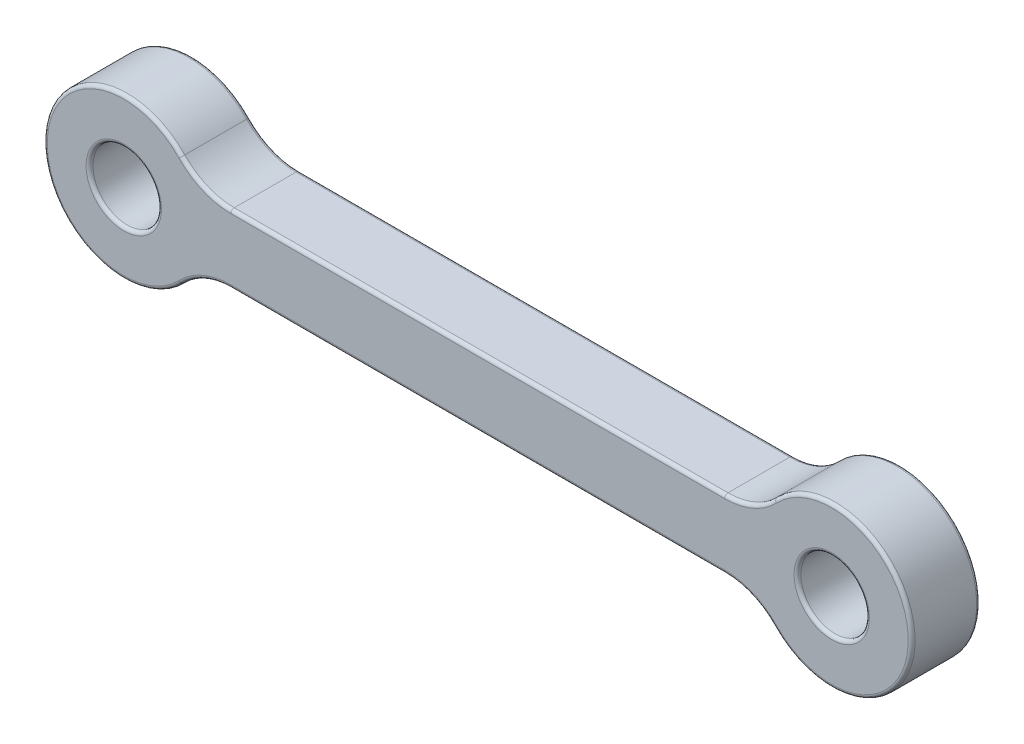
ISO-10303-21;
HEADER;
FILE_DESCRIPTION(('STEP AP214'),'2;1');
FILE_NAME('part.step','',(''),(''),'','','');
FILE_SCHEMA(('AUTOMOTIVE_DESIGN { 1 0 10303 214 1 1 1 1 }'));
ENDSEC;
DATA;
#1=APPLICATION_CONTEXT('core data for automotive mechanical design processes');
#2=APPLICATION_PROTOCOL_DEFINITION('international standard','automotive_design',2000,#1);
#3=PRODUCT_CONTEXT('',#1,'mechanical');
#4=PRODUCT('Part','Part','',(#3));
#5=PRODUCT_RELATED_PRODUCT_CATEGORY('part','',(#4));
#6=PRODUCT_DEFINITION_FORMATION('','',#4);
#7=PRODUCT_DEFINITION_CONTEXT('part definition',#1,'design');
#8=PRODUCT_DEFINITION('design','',#6,#7);
#9=PRODUCT_DEFINITION_SHAPE('','',#8);
#10=(LENGTH_UNIT() NAMED_UNIT(*) SI_UNIT(.MILLI.,.METRE.));
#11=(NAMED_UNIT(*) PLANE_ANGLE_UNIT() SI_UNIT($,.RADIAN.));
#12=(NAMED_UNIT(*) SI_UNIT($,.STERADIAN.) SOLID_ANGLE_UNIT());
#13=UNCERTAINTY_MEASURE_WITH_UNIT(LENGTH_MEASURE(1.E-05),#10,'distance_accuracy_value','');
#14=(GEOMETRIC_REPRESENTATION_CONTEXT(3) GLOBAL_UNCERTAINTY_ASSIGNED_CONTEXT((#13)) GLOBAL_UNIT_ASSIGNED_CONTEXT((#10,
#11,#12)) REPRESENTATION_CONTEXT('',''));
#15=CARTESIAN_POINT('',(0.,0.,0.));
#16=DIRECTION('',(0.,0.,1.));
#17=DIRECTION('',(1.,0.,0.));
#18=AXIS2_PLACEMENT_3D('',#15,#16,#17);
#19=CARTESIAN_POINT('',(0.,0.,1.5));
#20=DIRECTION('',(0.,0.,-1.));
#21=DIRECTION('',(-1.,0.,0.));
#22=AXIS2_PLACEMENT_3D('',#19,#20,#21);
#23=CYLINDRICAL_SURFACE('',#22,3.5);
#24=DIRECTION('',(0.,0.,-1.));
#25=VECTOR('',#24,1.);
#26=CARTESIAN_POINT('',(2.52560848605877,2.42307692307692,1.5));
#27=LINE('',#26,#25);
#28=CARTESIAN_POINT('',(2.52560848605877,2.42307692307692,1.35));
#29=VERTEX_POINT('',#28);
#30=CARTESIAN_POINT('',(2.52560848605877,2.42307692307692,-1.35));
#31=VERTEX_POINT('',#30);
#32=EDGE_CURVE('E302',#29,#31,#27,.T.);
#33=ORIENTED_EDGE('',*,*,#32,.T.);
#34=CARTESIAN_POINT('',(0.,0.,-1.35));
#35=DIRECTION('',(0.,0.,1.));
#36=DIRECTION('',(1.,0.,0.));
#37=AXIS2_PLACEMENT_3D('',#34,#35,#36);
#38=CIRCLE('',#37,3.5);
#39=CARTESIAN_POINT('',(2.52560848605877,-2.42307692307692,-1.35));
#40=VERTEX_POINT('',#39);
#41=EDGE_CURVE('E216',#31,#40,#38,.T.);
#42=ORIENTED_EDGE('',*,*,#41,.T.);
#43=DIRECTION('',(0.,0.,-1.));
#44=VECTOR('',#43,1.);
#45=CARTESIAN_POINT('',(2.52560848605877,-2.42307692307692,1.5));
#46=LINE('',#45,#44);
#47=CARTESIAN_POINT('',(2.52560848605877,-2.42307692307692,1.35));
#48=VERTEX_POINT('',#47);
#49=EDGE_CURVE('E295',#40,#48,#46,.F.);
#50=ORIENTED_EDGE('',*,*,#49,.T.);
#51=CARTESIAN_POINT('',(0.,0.,1.35));
#52=DIRECTION('',(0.,0.,1.));
#53=DIRECTION('',(1.,0.,0.));
#54=AXIS2_PLACEMENT_3D('',#51,#52,#53);
#55=CIRCLE('',#54,3.5);
#56=EDGE_CURVE('E214',#48,#29,#55,.F.);
#57=ORIENTED_EDGE('',*,*,#56,.T.);
#58=EDGE_LOOP('',(#33,#42,#50,#57));
#59=FACE_BOUND('',#58,.T.);
#60=ADVANCED_FACE('F36',(#59),#23,.T.);
#61=CARTESIAN_POINT('',(0.,-1.5,1.5));
#62=DIRECTION('',(0.,-1.,0.));
#63=DIRECTION('',(0.,0.,-1.));
#64=AXIS2_PLACEMENT_3D('',#61,#62,#63);
#65=PLANE('',#64);
#66=DIRECTION('',(0.,0.,-1.));
#67=VECTOR('',#66,1.);
#68=CARTESIAN_POINT('',(4.69041575982343,-1.5,1.5));
#69=LINE('',#68,#67);
#70=CARTESIAN_POINT('',(4.69041575982343,-1.5,1.35));
#71=VERTEX_POINT('',#70);
#72=CARTESIAN_POINT('',(4.69041575982343,-1.5,-1.35));
#73=VERTEX_POINT('',#72);
#74=EDGE_CURVE('E297',#71,#73,#69,.T.);
#75=ORIENTED_EDGE('',*,*,#74,.T.);
#76=DIRECTION('',(-1.,0.,0.));
#77=VECTOR('',#76,1.);
#78=CARTESIAN_POINT('',(26.3095842401766,-1.5,-1.35));
#79=LINE('',#78,#77);
#80=CARTESIAN_POINT('',(26.3095842401766,-1.5,-1.35));
#81=VERTEX_POINT('',#80);
#82=EDGE_CURVE('E191',#73,#81,#79,.F.);
#83=ORIENTED_EDGE('',*,*,#82,.T.);
#84=DIRECTION('',(0.,0.,1.));
#85=VECTOR('',#84,1.);
#86=CARTESIAN_POINT('',(26.3095842401766,-1.5,1.5));
#87=LINE('',#86,#85);
#88=CARTESIAN_POINT('',(26.3095842401766,-1.5,1.35));
#89=VERTEX_POINT('',#88);
#90=EDGE_CURVE('E257',#81,#89,#87,.T.);
#91=ORIENTED_EDGE('',*,*,#90,.T.);
#92=DIRECTION('',(-1.,0.,0.));
#93=VECTOR('',#92,1.);
#94=CARTESIAN_POINT('',(0.,-1.5,1.35));
#95=LINE('',#94,#93);
#96=EDGE_CURVE('E189',#89,#71,#95,.T.);
#97=ORIENTED_EDGE('',*,*,#96,.T.);
#98=EDGE_LOOP('',(#75,#83,#91,#97));
#99=FACE_BOUND('',#98,.T.);
#100=ADVANCED_FACE('F345',(#99),#65,.T.);
#101=CARTESIAN_POINT('',(31.,0.,1.5));
#102=DIRECTION('',(0.,0.,-1.));
#103=DIRECTION('',(-1.,0.,0.));
#104=AXIS2_PLACEMENT_3D('',#101,#102,#103);
#105=CYLINDRICAL_SURFACE('',#104,3.5);
#106=DIRECTION('',(0.,0.,-1.));
#107=VECTOR('',#106,1.);
#108=CARTESIAN_POINT('',(28.4743915139412,-2.42307692307692,1.5));
#109=LINE('',#108,#107);
#110=CARTESIAN_POINT('',(28.4743915139412,-2.42307692307692,1.35));
#111=VERTEX_POINT('',#110);
#112=CARTESIAN_POINT('',(28.4743915139412,-2.42307692307692,-1.35));
#113=VERTEX_POINT('',#112);
#114=EDGE_CURVE('E305',#111,#113,#109,.T.);
#115=ORIENTED_EDGE('',*,*,#114,.T.);
#116=CARTESIAN_POINT('',(31.,0.,-1.35));
#117=DIRECTION('',(0.,0.,1.));
#118=DIRECTION('',(1.,0.,0.));
#119=AXIS2_PLACEMENT_3D('',#116,#117,#118);
#120=CIRCLE('',#119,3.5);
#121=CARTESIAN_POINT('',(28.4743915139412,2.42307692307692,-1.35));
#122=VERTEX_POINT('',#121);
#123=EDGE_CURVE('E199',#113,#122,#120,.T.);
#124=ORIENTED_EDGE('',*,*,#123,.T.);
#125=DIRECTION('',(0.,0.,-1.));
#126=VECTOR('',#125,1.);
#127=CARTESIAN_POINT('',(28.4743915139412,2.42307692307692,1.5));
#128=LINE('',#127,#126);
#129=CARTESIAN_POINT('',(28.4743915139412,2.42307692307692,1.35));
#130=VERTEX_POINT('',#129);
#131=EDGE_CURVE('E301',#122,#130,#128,.F.);
#132=ORIENTED_EDGE('',*,*,#131,.T.);
#133=CARTESIAN_POINT('',(31.,0.,1.35));
#134=DIRECTION('',(0.,0.,1.));
#135=DIRECTION('',(1.,0.,0.));
#136=AXIS2_PLACEMENT_3D('',#133,#134,#135);
#137=CIRCLE('',#136,3.5);
#138=EDGE_CURVE('E197',#130,#111,#137,.F.);
#139=ORIENTED_EDGE('',*,*,#138,.T.);
#140=EDGE_LOOP('',(#115,#124,#132,#139));
#141=FACE_BOUND('',#140,.T.);
#142=ADVANCED_FACE('F391',(#141),#105,.T.);
#143=CARTESIAN_POINT('',(0.,1.5,1.5));
#144=DIRECTION('',(0.,-1.,0.));
#145=DIRECTION('',(0.,0.,-1.));
#146=AXIS2_PLACEMENT_3D('',#143,#144,#145);
#147=PLANE('',#146);
#148=DIRECTION('',(0.,0.,-1.));
#149=VECTOR('',#148,1.);
#150=CARTESIAN_POINT('',(26.3095842401766,1.5,1.5));
#151=LINE('',#150,#149);
#152=CARTESIAN_POINT('',(26.3095842401766,1.5,1.35));
#153=VERTEX_POINT('',#152);
#154=CARTESIAN_POINT('',(26.3095842401766,1.5,-1.35));
#155=VERTEX_POINT('',#154);
#156=EDGE_CURVE('E315',#153,#155,#151,.T.);
#157=ORIENTED_EDGE('',*,*,#156,.T.);
#158=DIRECTION('',(-1.,0.,0.));
#159=VECTOR('',#158,1.);
#160=CARTESIAN_POINT('',(0.,1.5,-1.35));
#161=LINE('',#160,#159);
#162=CARTESIAN_POINT('',(4.69041575982343,1.5,-1.35));
#163=VERTEX_POINT('',#162);
#164=EDGE_CURVE('E208',#155,#163,#161,.T.);
#165=ORIENTED_EDGE('',*,*,#164,.T.);
#166=DIRECTION('',(0.,0.,1.));
#167=VECTOR('',#166,1.);
#168=CARTESIAN_POINT('',(4.69041575982343,1.5,1.5));
#169=LINE('',#168,#167);
#170=CARTESIAN_POINT('',(4.69041575982343,1.5,1.35));
#171=VERTEX_POINT('',#170);
#172=EDGE_CURVE('E312',#163,#171,#169,.T.);
#173=ORIENTED_EDGE('',*,*,#172,.T.);
#174=DIRECTION('',(-1.,0.,0.));
#175=VECTOR('',#174,1.);
#176=CARTESIAN_POINT('',(26.3095842401766,1.5,1.35));
#177=LINE('',#176,#175);
#178=EDGE_CURVE('E206',#171,#153,#177,.F.);
#179=ORIENTED_EDGE('',*,*,#178,.T.);
#180=EDGE_LOOP('',(#157,#165,#173,#179));
#181=FACE_BOUND('',#180,.T.);
#182=ADVANCED_FACE('F375',(#181),#147,.F.);
#183=CARTESIAN_POINT('',(0.,0.,1.5));
#184=DIRECTION('',(0.,0.,-1.));
#185=DIRECTION('',(-1.,0.,0.));
#186=AXIS2_PLACEMENT_3D('',#183,#184,#185);
#187=CYLINDRICAL_SURFACE('',#186,1.5);
#188=CARTESIAN_POINT('',(0.,0.,-1.35));
#189=DIRECTION('',(0.,0.,1.));
#190=DIRECTION('',(1.,0.,0.));
#191=AXIS2_PLACEMENT_3D('',#188,#189,#190);
#192=CIRCLE('',#191,1.5);
#193=CARTESIAN_POINT('',(1.5,0.,-1.35));
#194=VERTEX_POINT('',#193);
#195=EDGE_CURVE('E221',#194,#194,#192,.F.);
#196=ORIENTED_EDGE('',*,*,#195,.T.);
#197=EDGE_LOOP('',(#196));
#198=FACE_BOUND('',#197,.T.);
#199=CARTESIAN_POINT('',(0.,0.,1.35));
#200=DIRECTION('',(0.,0.,1.));
#201=DIRECTION('',(1.,0.,0.));
#202=AXIS2_PLACEMENT_3D('',#199,#200,#201);
#203=CIRCLE('',#202,1.5);
#204=CARTESIAN_POINT('',(1.5,0.,1.35));
#205=VERTEX_POINT('',#204);
#206=EDGE_CURVE('E218',#205,#205,#203,.T.);
#207=ORIENTED_EDGE('',*,*,#206,.T.);
#208=EDGE_LOOP('',(#207));
#209=FACE_BOUND('',#208,.T.);
#210=ADVANCED_FACE('F398',(#198,#209),#187,.F.);
#211=CARTESIAN_POINT('',(31.,0.,1.5));
#212=DIRECTION('',(0.,0.,-1.));
#213=DIRECTION('',(-1.,0.,0.));
#214=AXIS2_PLACEMENT_3D('',#211,#212,#213);
#215=CYLINDRICAL_SURFACE('',#214,1.5);
#216=CARTESIAN_POINT('',(31.,0.,-1.35));
#217=DIRECTION('',(0.,0.,1.));
#218=DIRECTION('',(1.,0.,0.));
#219=AXIS2_PLACEMENT_3D('',#216,#217,#218);
#220=CIRCLE('',#219,1.5);
#221=CARTESIAN_POINT('',(32.5,0.,-1.35));
#222=VERTEX_POINT('',#221);
#223=EDGE_CURVE('E321',#222,#222,#220,.F.);
#224=ORIENTED_EDGE('',*,*,#223,.T.);
#225=EDGE_LOOP('',(#224));
#226=FACE_BOUND('',#225,.T.);
#227=CARTESIAN_POINT('',(31.,0.,1.35));
#228=DIRECTION('',(0.,0.,1.));
#229=DIRECTION('',(1.,0.,0.));
#230=AXIS2_PLACEMENT_3D('',#227,#228,#229);
#231=CIRCLE('',#230,1.5);
#232=CARTESIAN_POINT('',(32.5,0.,1.35));
#233=VERTEX_POINT('',#232);
#234=EDGE_CURVE('E318',#233,#233,#231,.T.);
#235=ORIENTED_EDGE('',*,*,#234,.T.);
#236=EDGE_LOOP('',(#235));
#237=FACE_BOUND('',#236,.T.);
#238=ADVANCED_FACE('F408',(#226,#237),#215,.F.);
#239=CARTESIAN_POINT('',(0.,0.,1.5));
#240=DIRECTION('',(0.,0.,1.));
#241=DIRECTION('',(1.,0.,0.));
#242=AXIS2_PLACEMENT_3D('',#239,#240,#241);
#243=PLANE('',#242);
#244=CARTESIAN_POINT('',(31.,0.,1.5));
#245=DIRECTION('',(0.,0.,1.));
#246=DIRECTION('',(1.,0.,0.));
#247=AXIS2_PLACEMENT_3D('',#244,#245,#246);
#248=CIRCLE('',#247,1.65);
#249=CARTESIAN_POINT('',(32.65,0.,1.5));
#250=VERTEX_POINT('',#249);
#251=EDGE_CURVE('E11',#250,#250,#248,.F.);
#252=ORIENTED_EDGE('',*,*,#251,.T.);
#253=EDGE_LOOP('',(#252));
#254=FACE_BOUND('',#253,.T.);
#255=CARTESIAN_POINT('',(31.,0.,1.5));
#256=DIRECTION('',(0.,0.,1.));
#257=DIRECTION('',(1.,0.,0.));
#258=AXIS2_PLACEMENT_3D('',#255,#256,#257);
#259=CIRCLE('',#258,3.35);
#260=CARTESIAN_POINT('',(28.5826318776295,-2.31923076923077,1.5));
#261=VERTEX_POINT('',#260);
#262=CARTESIAN_POINT('',(28.5826318776295,2.31923076923077,1.5));
#263=VERTEX_POINT('',#262);
#264=EDGE_CURVE('E53',#261,#263,#259,.T.);
#265=ORIENTED_EDGE('',*,*,#264,.T.);
#266=CARTESIAN_POINT('',(26.3095842401766,4.5,1.5));
#267=DIRECTION('',(0.,0.,1.));
#268=DIRECTION('',(1.,0.,0.));
#269=AXIS2_PLACEMENT_3D('',#266,#267,#268);
#270=CIRCLE('',#269,3.15);
#271=CARTESIAN_POINT('',(26.3095842401766,1.35,1.5));
#272=VERTEX_POINT('',#271);
#273=EDGE_CURVE('E45',#263,#272,#270,.F.);
#274=ORIENTED_EDGE('',*,*,#273,.T.);
#275=DIRECTION('',(-1.,0.,0.));
#276=VECTOR('',#275,1.);
#277=CARTESIAN_POINT('',(4.69041575982343,1.35,1.5));
#278=LINE('',#277,#276);
#279=CARTESIAN_POINT('',(4.69041575982343,1.35,1.5));
#280=VERTEX_POINT('',#279);
#281=EDGE_CURVE('E227',#272,#280,#278,.T.);
#282=ORIENTED_EDGE('',*,*,#281,.T.);
#283=CARTESIAN_POINT('',(4.69041575982343,4.5,1.5));
#284=DIRECTION('',(0.,0.,1.));
#285=DIRECTION('',(1.,0.,0.));
#286=AXIS2_PLACEMENT_3D('',#283,#284,#285);
#287=CIRCLE('',#286,3.15);
#288=CARTESIAN_POINT('',(2.41736812237053,2.31923076923077,1.5));
#289=VERTEX_POINT('',#288);
#290=EDGE_CURVE('E229',#280,#289,#287,.F.);
#291=ORIENTED_EDGE('',*,*,#290,.T.);
#292=CARTESIAN_POINT('',(0.,0.,1.5));
#293=DIRECTION('',(0.,0.,1.));
#294=DIRECTION('',(1.,0.,0.));
#295=AXIS2_PLACEMENT_3D('',#292,#293,#294);
#296=CIRCLE('',#295,3.35);
#297=CARTESIAN_POINT('',(2.41736812237053,-2.31923076923077,1.5));
#298=VERTEX_POINT('',#297);
#299=EDGE_CURVE('E231',#289,#298,#296,.T.);
#300=ORIENTED_EDGE('',*,*,#299,.T.);
#301=CARTESIAN_POINT('',(4.69041575982343,-4.5,1.5));
#302=DIRECTION('',(0.,0.,1.));
#303=DIRECTION('',(1.,0.,0.));
#304=AXIS2_PLACEMENT_3D('',#301,#302,#303);
#305=CIRCLE('',#304,3.15);
#306=CARTESIAN_POINT('',(4.69041575982343,-1.35,1.5));
#307=VERTEX_POINT('',#306);
#308=EDGE_CURVE('E233',#298,#307,#305,.F.);
#309=ORIENTED_EDGE('',*,*,#308,.T.);
#310=DIRECTION('',(-1.,0.,0.));
#311=VECTOR('',#310,1.);
#312=CARTESIAN_POINT('',(0.,-1.35,1.5));
#313=LINE('',#312,#311);
#314=CARTESIAN_POINT('',(26.3095842401766,-1.35,1.5));
#315=VERTEX_POINT('',#314);
#316=EDGE_CURVE('E235',#307,#315,#313,.F.);
#317=ORIENTED_EDGE('',*,*,#316,.T.);
#318=CARTESIAN_POINT('',(26.3095842401766,-4.5,1.5));
#319=DIRECTION('',(0.,0.,1.));
#320=DIRECTION('',(1.,0.,0.));
#321=AXIS2_PLACEMENT_3D('',#318,#319,#320);
#322=CIRCLE('',#321,3.15);
#323=EDGE_CURVE('E58',#315,#261,#322,.F.);
#324=ORIENTED_EDGE('',*,*,#323,.T.);
#325=EDGE_LOOP('',(#265,#274,#282,#291,#300,#309,#317,#324));
#326=FACE_BOUND('',#325,.T.);
#327=CARTESIAN_POINT('',(0.,0.,1.5));
#328=DIRECTION('',(0.,0.,1.));
#329=DIRECTION('',(1.,0.,0.));
#330=AXIS2_PLACEMENT_3D('',#327,#328,#329);
#331=CIRCLE('',#330,1.65);
#332=CARTESIAN_POINT('',(1.65,0.,1.5));
#333=VERTEX_POINT('',#332);
#334=EDGE_CURVE('E224',#333,#333,#331,.F.);
#335=ORIENTED_EDGE('',*,*,#334,.T.);
#336=EDGE_LOOP('',(#335));
#337=FACE_BOUND('',#336,.T.);
#338=ADVANCED_FACE('F362',(#254,#326,#337),#243,.T.);
#339=CARTESIAN_POINT('',(0.,0.,-1.5));
#340=DIRECTION('',(0.,0.,1.));
#341=DIRECTION('',(1.,0.,0.));
#342=AXIS2_PLACEMENT_3D('',#339,#340,#341);
#343=PLANE('',#342);
#344=CARTESIAN_POINT('',(31.,0.,-1.5));
#345=DIRECTION('',(0.,0.,1.));
#346=DIRECTION('',(1.,0.,0.));
#347=AXIS2_PLACEMENT_3D('',#344,#345,#346);
#348=CIRCLE('',#347,1.65);
#349=CARTESIAN_POINT('',(32.65,0.,-1.5));
#350=VERTEX_POINT('',#349);
#351=EDGE_CURVE('E178',#350,#350,#348,.T.);
#352=ORIENTED_EDGE('',*,*,#351,.T.);
#353=EDGE_LOOP('',(#352));
#354=FACE_BOUND('',#353,.T.);
#355=DIRECTION('',(-1.,0.,0.));
#356=VECTOR('',#355,1.);
#357=CARTESIAN_POINT('',(4.69041575982343,-1.35,-1.5));
#358=LINE('',#357,#356);
#359=CARTESIAN_POINT('',(26.3095842401766,-1.35,-1.5));
#360=VERTEX_POINT('',#359);
#361=CARTESIAN_POINT('',(4.69041575982343,-1.35,-1.5));
#362=VERTEX_POINT('',#361);
#363=EDGE_CURVE('E176',#360,#362,#358,.T.);
#364=ORIENTED_EDGE('',*,*,#363,.T.);
#365=CARTESIAN_POINT('',(4.69041575982343,-4.5,-1.5));
#366=DIRECTION('',(0.,0.,1.));
#367=DIRECTION('',(1.,0.,0.));
#368=AXIS2_PLACEMENT_3D('',#365,#366,#367);
#369=CIRCLE('',#368,3.15);
#370=CARTESIAN_POINT('',(2.41736812237053,-2.31923076923077,-1.5));
#371=VERTEX_POINT('',#370);
#372=EDGE_CURVE('E156',#362,#371,#369,.T.);
#373=ORIENTED_EDGE('',*,*,#372,.T.);
#374=CARTESIAN_POINT('',(0.,0.,-1.5));
#375=DIRECTION('',(0.,0.,1.));
#376=DIRECTION('',(1.,0.,0.));
#377=AXIS2_PLACEMENT_3D('',#374,#375,#376);
#378=CIRCLE('',#377,3.35);
#379=CARTESIAN_POINT('',(2.41736812237053,2.31923076923077,-1.5));
#380=VERTEX_POINT('',#379);
#381=EDGE_CURVE('E164',#371,#380,#378,.F.);
#382=ORIENTED_EDGE('',*,*,#381,.T.);
#383=CARTESIAN_POINT('',(4.69041575982343,4.5,-1.5));
#384=DIRECTION('',(0.,0.,1.));
#385=DIRECTION('',(1.,0.,0.));
#386=AXIS2_PLACEMENT_3D('',#383,#384,#385);
#387=CIRCLE('',#386,3.15);
#388=CARTESIAN_POINT('',(4.69041575982343,1.35,-1.5));
#389=VERTEX_POINT('',#388);
#390=EDGE_CURVE('E170',#380,#389,#387,.T.);
#391=ORIENTED_EDGE('',*,*,#390,.T.);
#392=DIRECTION('',(-1.,0.,0.));
#393=VECTOR('',#392,1.);
#394=CARTESIAN_POINT('',(0.,1.35,-1.5));
#395=LINE('',#394,#393);
#396=CARTESIAN_POINT('',(26.3095842401766,1.35,-1.5));
#397=VERTEX_POINT('',#396);
#398=EDGE_CURVE('E327',#389,#397,#395,.F.);
#399=ORIENTED_EDGE('',*,*,#398,.T.);
#400=CARTESIAN_POINT('',(26.3095842401766,4.5,-1.5));
#401=DIRECTION('',(0.,0.,1.));
#402=DIRECTION('',(1.,0.,0.));
#403=AXIS2_PLACEMENT_3D('',#400,#401,#402);
#404=CIRCLE('',#403,3.15);
#405=CARTESIAN_POINT('',(28.5826318776295,2.31923076923077,-1.5));
#406=VERTEX_POINT('',#405);
#407=EDGE_CURVE('E329',#397,#406,#404,.T.);
#408=ORIENTED_EDGE('',*,*,#407,.T.);
#409=CARTESIAN_POINT('',(31.,0.,-1.5));
#410=DIRECTION('',(0.,0.,1.));
#411=DIRECTION('',(1.,0.,0.));
#412=AXIS2_PLACEMENT_3D('',#409,#410,#411);
#413=CIRCLE('',#412,3.35);
#414=CARTESIAN_POINT('',(28.5826318776295,-2.31923076923077,-1.5));
#415=VERTEX_POINT('',#414);
#416=EDGE_CURVE('E331',#406,#415,#413,.F.);
#417=ORIENTED_EDGE('',*,*,#416,.T.);
#418=CARTESIAN_POINT('',(26.3095842401766,-4.5,-1.5));
#419=DIRECTION('',(0.,0.,1.));
#420=DIRECTION('',(1.,0.,0.));
#421=AXIS2_PLACEMENT_3D('',#418,#419,#420);
#422=CIRCLE('',#421,3.15);
#423=EDGE_CURVE('E183',#415,#360,#422,.T.);
#424=ORIENTED_EDGE('',*,*,#423,.T.);
#425=EDGE_LOOP('',(#364,#373,#382,#391,#399,#408,#417,#424));
#426=FACE_BOUND('',#425,.T.);
#427=CARTESIAN_POINT('',(0.,0.,-1.5));
#428=DIRECTION('',(0.,0.,1.));
#429=DIRECTION('',(1.,0.,0.));
#430=AXIS2_PLACEMENT_3D('',#427,#428,#429);
#431=CIRCLE('',#430,1.65);
#432=CARTESIAN_POINT('',(1.65,0.,-1.5));
#433=VERTEX_POINT('',#432);
#434=EDGE_CURVE('E171',#433,#433,#431,.T.);
#435=ORIENTED_EDGE('',*,*,#434,.T.);
#436=EDGE_LOOP('',(#435));
#437=FACE_BOUND('',#436,.T.);
#438=ADVANCED_FACE('F173',(#354,#426,#437),#343,.F.);
#439=CARTESIAN_POINT('',(4.69041575982343,-4.5,1.5));
#440=DIRECTION('',(0.,0.,-1.));
#441=DIRECTION('',(-1.,0.,0.));
#442=AXIS2_PLACEMENT_3D('',#439,#440,#441);
#443=CYLINDRICAL_SURFACE('',#442,3.);
#444=ORIENTED_EDGE('',*,*,#49,.F.);
#445=CARTESIAN_POINT('',(4.69041575982343,-4.5,-1.35));
#446=DIRECTION('',(0.,0.,1.));
#447=DIRECTION('',(1.,0.,0.));
#448=AXIS2_PLACEMENT_3D('',#445,#446,#447);
#449=CIRCLE('',#448,3.);
#450=EDGE_CURVE('E158',#40,#73,#449,.F.);
#451=ORIENTED_EDGE('',*,*,#450,.T.);
#452=ORIENTED_EDGE('',*,*,#74,.F.);
#453=CARTESIAN_POINT('',(4.69041575982343,-4.5,1.35));
#454=DIRECTION('',(0.,0.,1.));
#455=DIRECTION('',(1.,0.,0.));
#456=AXIS2_PLACEMENT_3D('',#453,#454,#455);
#457=CIRCLE('',#456,3.);
#458=EDGE_CURVE('E181',#71,#48,#457,.T.);
#459=ORIENTED_EDGE('',*,*,#458,.T.);
#460=EDGE_LOOP('',(#444,#451,#452,#459));
#461=FACE_BOUND('',#460,.T.);
#462=ADVANCED_FACE('F294',(#461),#443,.F.);
#463=CARTESIAN_POINT('',(26.3095842401766,-4.5,1.5));
#464=DIRECTION('',(0.,0.,-1.));
#465=DIRECTION('',(-1.,0.,0.));
#466=AXIS2_PLACEMENT_3D('',#463,#464,#465);
#467=CYLINDRICAL_SURFACE('',#466,3.);
#468=ORIENTED_EDGE('',*,*,#90,.F.);
#469=CARTESIAN_POINT('',(26.3095842401766,-4.5,-1.35));
#470=DIRECTION('',(0.,0.,1.));
#471=DIRECTION('',(1.,0.,0.));
#472=AXIS2_PLACEMENT_3D('',#469,#470,#471);
#473=CIRCLE('',#472,3.);
#474=EDGE_CURVE('E195',#81,#113,#473,.F.);
#475=ORIENTED_EDGE('',*,*,#474,.T.);
#476=ORIENTED_EDGE('',*,*,#114,.F.);
#477=CARTESIAN_POINT('',(26.3095842401766,-4.5,1.35));
#478=DIRECTION('',(0.,0.,1.));
#479=DIRECTION('',(1.,0.,0.));
#480=AXIS2_PLACEMENT_3D('',#477,#478,#479);
#481=CIRCLE('',#480,3.);
#482=EDGE_CURVE('E193',#111,#89,#481,.T.);
#483=ORIENTED_EDGE('',*,*,#482,.T.);
#484=EDGE_LOOP('',(#468,#475,#476,#483));
#485=FACE_BOUND('',#484,.T.);
#486=ADVANCED_FACE('F348',(#485),#467,.F.);
#487=CARTESIAN_POINT('',(26.3095842401766,4.5,1.5));
#488=DIRECTION('',(0.,0.,-1.));
#489=DIRECTION('',(-1.,0.,0.));
#490=AXIS2_PLACEMENT_3D('',#487,#488,#489);
#491=CYLINDRICAL_SURFACE('',#490,3.);
#492=ORIENTED_EDGE('',*,*,#131,.F.);
#493=CARTESIAN_POINT('',(26.3095842401766,4.5,-1.35));
#494=DIRECTION('',(0.,0.,1.));
#495=DIRECTION('',(1.,0.,0.));
#496=AXIS2_PLACEMENT_3D('',#493,#494,#495);
#497=CIRCLE('',#496,3.);
#498=EDGE_CURVE('E204',#122,#155,#497,.F.);
#499=ORIENTED_EDGE('',*,*,#498,.T.);
#500=ORIENTED_EDGE('',*,*,#156,.F.);
#501=CARTESIAN_POINT('',(26.3095842401766,4.5,1.35));
#502=DIRECTION('',(0.,0.,1.));
#503=DIRECTION('',(1.,0.,0.));
#504=AXIS2_PLACEMENT_3D('',#501,#502,#503);
#505=CIRCLE('',#504,3.);
#506=EDGE_CURVE('E201',#153,#130,#505,.T.);
#507=ORIENTED_EDGE('',*,*,#506,.T.);
#508=EDGE_LOOP('',(#492,#499,#500,#507));
#509=FACE_BOUND('',#508,.T.);
#510=ADVANCED_FACE('F380',(#509),#491,.F.);
#511=CARTESIAN_POINT('',(4.69041575982343,4.5,1.5));
#512=DIRECTION('',(0.,0.,-1.));
#513=DIRECTION('',(-1.,0.,0.));
#514=AXIS2_PLACEMENT_3D('',#511,#512,#513);
#515=CYLINDRICAL_SURFACE('',#514,3.);
#516=ORIENTED_EDGE('',*,*,#172,.F.);
#517=CARTESIAN_POINT('',(4.69041575982343,4.5,-1.35));
#518=DIRECTION('',(0.,0.,1.));
#519=DIRECTION('',(1.,0.,0.));
#520=AXIS2_PLACEMENT_3D('',#517,#518,#519);
#521=CIRCLE('',#520,3.);
#522=EDGE_CURVE('E212',#163,#31,#521,.F.);
#523=ORIENTED_EDGE('',*,*,#522,.T.);
#524=ORIENTED_EDGE('',*,*,#32,.F.);
#525=CARTESIAN_POINT('',(4.69041575982343,4.5,1.35));
#526=DIRECTION('',(0.,0.,1.));
#527=DIRECTION('',(1.,0.,0.));
#528=AXIS2_PLACEMENT_3D('',#525,#526,#527);
#529=CIRCLE('',#528,3.);
#530=EDGE_CURVE('E210',#29,#171,#529,.T.);
#531=ORIENTED_EDGE('',*,*,#530,.T.);
#532=EDGE_LOOP('',(#516,#523,#524,#531));
#533=FACE_BOUND('',#532,.T.);
#534=ADVANCED_FACE('F416',(#533),#515,.F.);
#535=CARTESIAN_POINT('',(31.,0.,-1.35));
#536=DIRECTION('',(0.,0.,1.));
#537=DIRECTION('',(1.,0.,0.));
#538=AXIS2_PLACEMENT_3D('',#535,#536,#537);
#539=TOROIDAL_SURFACE('',#538,1.65,0.15);
#540=ORIENTED_EDGE('',*,*,#351,.F.);
#541=EDGE_LOOP('',(#540));
#542=FACE_BOUND('',#541,.T.);
#543=ORIENTED_EDGE('',*,*,#223,.F.);
#544=EDGE_LOOP('',(#543));
#545=FACE_BOUND('',#544,.T.);
#546=ADVANCED_FACE('F419',(#542,#545),#539,.T.);
#547=CARTESIAN_POINT('',(26.3095842401766,4.5,-1.35));
#548=DIRECTION('',(0.,0.,1.));
#549=DIRECTION('',(1.,0.,0.));
#550=AXIS2_PLACEMENT_3D('',#547,#548,#549);
#551=TOROIDAL_SURFACE('',#550,3.15,0.15);
#552=CARTESIAN_POINT('',(26.3095842401766,1.35,-1.35));
#553=DIRECTION('',(-1.,0.,0.));
#554=DIRECTION('',(0.,0.,1.));
#555=AXIS2_PLACEMENT_3D('',#552,#553,#554);
#556=CIRCLE('',#555,0.15);
#557=EDGE_CURVE('E251',#155,#397,#556,.T.);
#558=ORIENTED_EDGE('',*,*,#557,.F.);
#559=ORIENTED_EDGE('',*,*,#498,.F.);
#560=CARTESIAN_POINT('',(28.5826318776295,2.31923076923077,-1.35));
#561=DIRECTION('',(0.692307692307703,0.72160242458821,0.));
#562=DIRECTION('',(-0.72160242458821,0.692307692307703,0.));
#563=AXIS2_PLACEMENT_3D('',#560,#561,#562);
#564=CIRCLE('',#563,0.15);
#565=EDGE_CURVE('E254',#406,#122,#564,.T.);
#566=ORIENTED_EDGE('',*,*,#565,.F.);
#567=ORIENTED_EDGE('',*,*,#407,.F.);
#568=EDGE_LOOP('',(#558,#559,#566,#567));
#569=FACE_BOUND('',#568,.T.);
#570=ADVANCED_FACE('F384',(#569),#551,.T.);
#571=CARTESIAN_POINT('',(31.,0.,-1.35));
#572=DIRECTION('',(0.,0.,1.));
#573=DIRECTION('',(1.,0.,0.));
#574=AXIS2_PLACEMENT_3D('',#571,#572,#573);
#575=TOROIDAL_SURFACE('',#574,3.35,0.15);
#576=ORIENTED_EDGE('',*,*,#565,.T.);
#577=ORIENTED_EDGE('',*,*,#123,.F.);
#578=CARTESIAN_POINT('',(28.5826318776295,-2.31923076923077,-1.35));
#579=DIRECTION('',(-0.692307692307698,0.721602424588214,0.));
#580=DIRECTION('',(-0.721602424588214,-0.692307692307698,0.));
#581=AXIS2_PLACEMENT_3D('',#578,#579,#580);
#582=CIRCLE('',#581,0.15);
#583=EDGE_CURVE('E248',#415,#113,#582,.T.);
#584=ORIENTED_EDGE('',*,*,#583,.F.);
#585=ORIENTED_EDGE('',*,*,#416,.F.);
#586=EDGE_LOOP('',(#576,#577,#584,#585));
#587=FACE_BOUND('',#586,.T.);
#588=ADVANCED_FACE('F389',(#587),#575,.T.);
#589=CARTESIAN_POINT('',(0.,1.35,-1.35));
#590=DIRECTION('',(-1.,0.,0.));
#591=DIRECTION('',(0.,0.,1.));
#592=AXIS2_PLACEMENT_3D('',#589,#590,#591);
#593=CYLINDRICAL_SURFACE('',#592,0.15);
#594=ORIENTED_EDGE('',*,*,#557,.T.);
#595=ORIENTED_EDGE('',*,*,#398,.F.);
#596=CARTESIAN_POINT('',(4.69041575982343,1.35,-1.35));
#597=DIRECTION('',(-1.,0.,0.));
#598=DIRECTION('',(0.,0.,1.));
#599=AXIS2_PLACEMENT_3D('',#596,#597,#598);
#600=CIRCLE('',#599,0.15);
#601=EDGE_CURVE('E245',#163,#389,#600,.T.);
#602=ORIENTED_EDGE('',*,*,#601,.F.);
#603=ORIENTED_EDGE('',*,*,#164,.F.);
#604=EDGE_LOOP('',(#594,#595,#602,#603));
#605=FACE_BOUND('',#604,.T.);
#606=ADVANCED_FACE('F437',(#605),#593,.T.);
#607=CARTESIAN_POINT('',(26.3095842401766,-4.5,-1.35));
#608=DIRECTION('',(0.,0.,1.));
#609=DIRECTION('',(1.,0.,0.));
#610=AXIS2_PLACEMENT_3D('',#607,#608,#609);
#611=TOROIDAL_SURFACE('',#610,3.15,0.15);
#612=ORIENTED_EDGE('',*,*,#583,.T.);
#613=ORIENTED_EDGE('',*,*,#474,.F.);
#614=CARTESIAN_POINT('',(26.3095842401766,-1.35,-1.35));
#615=DIRECTION('',(-1.,0.,0.));
#616=DIRECTION('',(0.,0.,1.));
#617=AXIS2_PLACEMENT_3D('',#614,#615,#616);
#618=CIRCLE('',#617,0.15);
#619=EDGE_CURVE('E242',#360,#81,#618,.T.);
#620=ORIENTED_EDGE('',*,*,#619,.F.);
#621=ORIENTED_EDGE('',*,*,#423,.F.);
#622=EDGE_LOOP('',(#612,#613,#620,#621));
#623=FACE_BOUND('',#622,.T.);
#624=ADVANCED_FACE('F338',(#623),#611,.T.);
#625=CARTESIAN_POINT('',(4.69041575982343,4.5,-1.35));
#626=DIRECTION('',(0.,0.,1.));
#627=DIRECTION('',(1.,0.,0.));
#628=AXIS2_PLACEMENT_3D('',#625,#626,#627);
#629=TOROIDAL_SURFACE('',#628,3.15,0.15);
#630=ORIENTED_EDGE('',*,*,#601,.T.);
#631=ORIENTED_EDGE('',*,*,#390,.F.);
#632=CARTESIAN_POINT('',(2.41736812237053,2.31923076923077,-1.35));
#633=DIRECTION('',(-0.692307692307693,0.72160242458822,0.));
#634=DIRECTION('',(-0.72160242458822,-0.692307692307693,0.));
#635=AXIS2_PLACEMENT_3D('',#632,#633,#634);
#636=CIRCLE('',#635,0.15);
#637=EDGE_CURVE('E167',#31,#380,#636,.T.);
#638=ORIENTED_EDGE('',*,*,#637,.F.);
#639=ORIENTED_EDGE('',*,*,#522,.F.);
#640=EDGE_LOOP('',(#630,#631,#638,#639));
#641=FACE_BOUND('',#640,.T.);
#642=ADVANCED_FACE('F431',(#641),#629,.T.);
#643=CARTESIAN_POINT('',(0.,-1.35,-1.35));
#644=DIRECTION('',(1.,0.,0.));
#645=DIRECTION('',(0.,0.,-1.));
#646=AXIS2_PLACEMENT_3D('',#643,#644,#645);
#647=CYLINDRICAL_SURFACE('',#646,0.15);
#648=ORIENTED_EDGE('',*,*,#619,.T.);
#649=ORIENTED_EDGE('',*,*,#82,.F.);
#650=CARTESIAN_POINT('',(4.69041575982343,-1.35,-1.35));
#651=DIRECTION('',(-1.,0.,0.));
#652=DIRECTION('',(0.,0.,1.));
#653=AXIS2_PLACEMENT_3D('',#650,#651,#652);
#654=CIRCLE('',#653,0.15);
#655=EDGE_CURVE('E161',#362,#73,#654,.T.);
#656=ORIENTED_EDGE('',*,*,#655,.F.);
#657=ORIENTED_EDGE('',*,*,#363,.F.);
#658=EDGE_LOOP('',(#648,#649,#656,#657));
#659=FACE_BOUND('',#658,.T.);
#660=ADVANCED_FACE('F341',(#659),#647,.T.);
#661=CARTESIAN_POINT('',(0.,0.,-1.35));
#662=DIRECTION('',(0.,0.,1.));
#663=DIRECTION('',(1.,0.,0.));
#664=AXIS2_PLACEMENT_3D('',#661,#662,#663);
#665=TOROIDAL_SURFACE('',#664,3.35,0.15);
#666=ORIENTED_EDGE('',*,*,#637,.T.);
#667=ORIENTED_EDGE('',*,*,#381,.F.);
#668=CARTESIAN_POINT('',(2.41736812237053,-2.31923076923077,-1.35));
#669=DIRECTION('',(0.692307692307693,0.72160242458822,0.));
#670=DIRECTION('',(-0.72160242458822,0.692307692307693,0.));
#671=AXIS2_PLACEMENT_3D('',#668,#669,#670);
#672=CIRCLE('',#671,0.15);
#673=EDGE_CURVE('E152',#40,#371,#672,.T.);
#674=ORIENTED_EDGE('',*,*,#673,.F.);
#675=ORIENTED_EDGE('',*,*,#41,.F.);
#676=EDGE_LOOP('',(#666,#667,#674,#675));
#677=FACE_BOUND('',#676,.T.);
#678=ADVANCED_FACE('F165',(#677),#665,.T.);
#679=CARTESIAN_POINT('',(4.69041575982343,-4.5,-1.35));
#680=DIRECTION('',(0.,0.,1.));
#681=DIRECTION('',(1.,0.,0.));
#682=AXIS2_PLACEMENT_3D('',#679,#680,#681);
#683=TOROIDAL_SURFACE('',#682,3.15,0.15);
#684=ORIENTED_EDGE('',*,*,#655,.T.);
#685=ORIENTED_EDGE('',*,*,#450,.F.);
#686=ORIENTED_EDGE('',*,*,#673,.T.);
#687=ORIENTED_EDGE('',*,*,#372,.F.);
#688=EDGE_LOOP('',(#684,#685,#686,#687));
#689=FACE_BOUND('',#688,.T.);
#690=ADVANCED_FACE('F154',(#689),#683,.T.);
#691=CARTESIAN_POINT('',(0.,0.,-1.35));
#692=DIRECTION('',(0.,0.,1.));
#693=DIRECTION('',(1.,0.,0.));
#694=AXIS2_PLACEMENT_3D('',#691,#692,#693);
#695=TOROIDAL_SURFACE('',#694,1.65,0.15);
#696=ORIENTED_EDGE('',*,*,#195,.F.);
#697=EDGE_LOOP('',(#696));
#698=FACE_BOUND('',#697,.T.);
#699=ORIENTED_EDGE('',*,*,#434,.F.);
#700=EDGE_LOOP('',(#699));
#701=FACE_BOUND('',#700,.T.);
#702=ADVANCED_FACE('F426',(#698,#701),#695,.T.);
#703=CARTESIAN_POINT('',(31.,0.,1.35));
#704=DIRECTION('',(0.,0.,1.));
#705=DIRECTION('',(1.,0.,0.));
#706=AXIS2_PLACEMENT_3D('',#703,#704,#705);
#707=TOROIDAL_SURFACE('',#706,1.65,0.15);
#708=ORIENTED_EDGE('',*,*,#234,.F.);
#709=EDGE_LOOP('',(#708));
#710=FACE_BOUND('',#709,.T.);
#711=ORIENTED_EDGE('',*,*,#251,.F.);
#712=EDGE_LOOP('',(#711));
#713=FACE_BOUND('',#712,.T.);
#714=ADVANCED_FACE('F447',(#710,#713),#707,.T.);
#715=CARTESIAN_POINT('',(4.69041575982343,-4.5,1.35));
#716=DIRECTION('',(0.,0.,1.));
#717=DIRECTION('',(1.,0.,0.));
#718=AXIS2_PLACEMENT_3D('',#715,#716,#717);
#719=TOROIDAL_SURFACE('',#718,3.15,0.15);
#720=CARTESIAN_POINT('',(2.41736812237053,-2.31923076923077,1.35));
#721=DIRECTION('',(-0.692307692307693,-0.72160242458822,0.));
#722=DIRECTION('',(0.72160242458822,-0.692307692307693,0.));
#723=AXIS2_PLACEMENT_3D('',#720,#721,#722);
#724=CIRCLE('',#723,0.15);
#725=EDGE_CURVE('E273',#48,#298,#724,.T.);
#726=ORIENTED_EDGE('',*,*,#725,.F.);
#727=ORIENTED_EDGE('',*,*,#458,.F.);
#728=CARTESIAN_POINT('',(4.69041575982343,-1.35,1.35));
#729=DIRECTION('',(1.,0.,0.));
#730=DIRECTION('',(0.,0.,-1.));
#731=AXIS2_PLACEMENT_3D('',#728,#729,#730);
#732=CIRCLE('',#731,0.15);
#733=EDGE_CURVE('E40',#307,#71,#732,.T.);
#734=ORIENTED_EDGE('',*,*,#733,.F.);
#735=ORIENTED_EDGE('',*,*,#308,.F.);
#736=EDGE_LOOP('',(#726,#727,#734,#735));
#737=FACE_BOUND('',#736,.T.);
#738=ADVANCED_FACE('F289',(#737),#719,.T.);
#739=CARTESIAN_POINT('',(0.,-1.35,1.35));
#740=DIRECTION('',(-1.,0.,0.));
#741=DIRECTION('',(0.,0.,1.));
#742=AXIS2_PLACEMENT_3D('',#739,#740,#741);
#743=CYLINDRICAL_SURFACE('',#742,0.15);
#744=ORIENTED_EDGE('',*,*,#733,.T.);
#745=ORIENTED_EDGE('',*,*,#96,.F.);
#746=CARTESIAN_POINT('',(26.3095842401766,-1.35,1.35));
#747=DIRECTION('',(1.,0.,0.));
#748=DIRECTION('',(0.,0.,-1.));
#749=AXIS2_PLACEMENT_3D('',#746,#747,#748);
#750=CIRCLE('',#749,0.15);
#751=EDGE_CURVE('E271',#315,#89,#750,.T.);
#752=ORIENTED_EDGE('',*,*,#751,.F.);
#753=ORIENTED_EDGE('',*,*,#316,.F.);
#754=EDGE_LOOP('',(#744,#745,#752,#753));
#755=FACE_BOUND('',#754,.T.);
#756=ADVANCED_FACE('F284',(#755),#743,.T.);
#757=CARTESIAN_POINT('',(0.,0.,1.35));
#758=DIRECTION('',(0.,0.,1.));
#759=DIRECTION('',(1.,0.,0.));
#760=AXIS2_PLACEMENT_3D('',#757,#758,#759);
#761=TOROIDAL_SURFACE('',#760,3.35,0.15);
#762=ORIENTED_EDGE('',*,*,#725,.T.);
#763=ORIENTED_EDGE('',*,*,#299,.F.);
#764=CARTESIAN_POINT('',(2.41736812237053,2.31923076923077,1.35));
#765=DIRECTION('',(0.692307692307693,-0.72160242458822,0.));
#766=DIRECTION('',(0.72160242458822,0.692307692307693,0.));
#767=AXIS2_PLACEMENT_3D('',#764,#765,#766);
#768=CIRCLE('',#767,0.15);
#769=EDGE_CURVE('E268',#29,#289,#768,.T.);
#770=ORIENTED_EDGE('',*,*,#769,.F.);
#771=ORIENTED_EDGE('',*,*,#56,.F.);
#772=EDGE_LOOP('',(#762,#763,#770,#771));
#773=FACE_BOUND('',#772,.T.);
#774=ADVANCED_FACE('F462',(#773),#761,.T.);
#775=CARTESIAN_POINT('',(26.3095842401766,-4.5,1.35));
#776=DIRECTION('',(0.,0.,1.));
#777=DIRECTION('',(1.,0.,0.));
#778=AXIS2_PLACEMENT_3D('',#775,#776,#777);
#779=TOROIDAL_SURFACE('',#778,3.15,0.15);
#780=ORIENTED_EDGE('',*,*,#751,.T.);
#781=ORIENTED_EDGE('',*,*,#482,.F.);
#782=CARTESIAN_POINT('',(28.5826318776295,-2.31923076923077,1.35));
#783=DIRECTION('',(0.692307692307703,-0.72160242458821,0.));
#784=DIRECTION('',(0.72160242458821,0.692307692307703,0.));
#785=AXIS2_PLACEMENT_3D('',#782,#783,#784);
#786=CIRCLE('',#785,0.15);
#787=EDGE_CURVE('E265',#261,#111,#786,.T.);
#788=ORIENTED_EDGE('',*,*,#787,.F.);
#789=ORIENTED_EDGE('',*,*,#323,.F.);
#790=EDGE_LOOP('',(#780,#781,#788,#789));
#791=FACE_BOUND('',#790,.T.);
#792=ADVANCED_FACE('F352',(#791),#779,.T.);
#793=CARTESIAN_POINT('',(4.69041575982343,4.5,1.35));
#794=DIRECTION('',(0.,0.,1.));
#795=DIRECTION('',(1.,0.,0.));
#796=AXIS2_PLACEMENT_3D('',#793,#794,#795);
#797=TOROIDAL_SURFACE('',#796,3.15,0.15);
#798=ORIENTED_EDGE('',*,*,#769,.T.);
#799=ORIENTED_EDGE('',*,*,#290,.F.);
#800=CARTESIAN_POINT('',(4.69041575982343,1.35,1.35));
#801=DIRECTION('',(1.,0.,0.));
#802=DIRECTION('',(0.,0.,-1.));
#803=AXIS2_PLACEMENT_3D('',#800,#801,#802);
#804=CIRCLE('',#803,0.15);
#805=EDGE_CURVE('E262',#171,#280,#804,.T.);
#806=ORIENTED_EDGE('',*,*,#805,.F.);
#807=ORIENTED_EDGE('',*,*,#530,.F.);
#808=EDGE_LOOP('',(#798,#799,#806,#807));
#809=FACE_BOUND('',#808,.T.);
#810=ADVANCED_FACE('F368',(#809),#797,.T.);
#811=CARTESIAN_POINT('',(31.,0.,1.35));
#812=DIRECTION('',(0.,0.,1.));
#813=DIRECTION('',(1.,0.,0.));
#814=AXIS2_PLACEMENT_3D('',#811,#812,#813);
#815=TOROIDAL_SURFACE('',#814,3.35,0.15);
#816=ORIENTED_EDGE('',*,*,#787,.T.);
#817=ORIENTED_EDGE('',*,*,#138,.F.);
#818=CARTESIAN_POINT('',(28.5826318776295,2.31923076923077,1.35));
#819=DIRECTION('',(-0.692307692307698,-0.721602424588214,0.));
#820=DIRECTION('',(0.721602424588214,-0.692307692307698,0.));
#821=AXIS2_PLACEMENT_3D('',#818,#819,#820);
#822=CIRCLE('',#821,0.15);
#823=EDGE_CURVE('E260',#263,#130,#822,.T.);
#824=ORIENTED_EDGE('',*,*,#823,.F.);
#825=ORIENTED_EDGE('',*,*,#264,.F.);
#826=EDGE_LOOP('',(#816,#817,#824,#825));
#827=FACE_BOUND('',#826,.T.);
#828=ADVANCED_FACE('F355',(#827),#815,.T.);
#829=CARTESIAN_POINT('',(0.,1.35,1.35));
#830=DIRECTION('',(1.,0.,0.));
#831=DIRECTION('',(0.,0.,-1.));
#832=AXIS2_PLACEMENT_3D('',#829,#830,#831);
#833=CYLINDRICAL_SURFACE('',#832,0.15);
#834=ORIENTED_EDGE('',*,*,#805,.T.);
#835=ORIENTED_EDGE('',*,*,#281,.F.);
#836=CARTESIAN_POINT('',(26.3095842401766,1.35,1.35));
#837=DIRECTION('',(1.,0.,0.));
#838=DIRECTION('',(0.,0.,-1.));
#839=AXIS2_PLACEMENT_3D('',#836,#837,#838);
#840=CIRCLE('',#839,0.15);
#841=EDGE_CURVE('E258',#153,#272,#840,.T.);
#842=ORIENTED_EDGE('',*,*,#841,.F.);
#843=ORIENTED_EDGE('',*,*,#178,.F.);
#844=EDGE_LOOP('',(#834,#835,#842,#843));
#845=FACE_BOUND('',#844,.T.);
#846=ADVANCED_FACE('F372',(#845),#833,.T.);
#847=CARTESIAN_POINT('',(26.3095842401766,4.5,1.35));
#848=DIRECTION('',(0.,0.,1.));
#849=DIRECTION('',(1.,0.,0.));
#850=AXIS2_PLACEMENT_3D('',#847,#848,#849);
#851=TOROIDAL_SURFACE('',#850,3.15,0.15);
#852=ORIENTED_EDGE('',*,*,#823,.T.);
#853=ORIENTED_EDGE('',*,*,#506,.F.);
#854=ORIENTED_EDGE('',*,*,#841,.T.);
#855=ORIENTED_EDGE('',*,*,#273,.F.);
#856=EDGE_LOOP('',(#852,#853,#854,#855));
#857=FACE_BOUND('',#856,.T.);
#858=ADVANCED_FACE('F359',(#857),#851,.T.);
#859=CARTESIAN_POINT('',(0.,0.,1.35));
#860=DIRECTION('',(0.,0.,1.));
#861=DIRECTION('',(1.,0.,0.));
#862=AXIS2_PLACEMENT_3D('',#859,#860,#861);
#863=TOROIDAL_SURFACE('',#862,1.65,0.15);
#864=ORIENTED_EDGE('',*,*,#334,.F.);
#865=EDGE_LOOP('',(#864));
#866=FACE_BOUND('',#865,.T.);
#867=ORIENTED_EDGE('',*,*,#206,.F.);
#868=EDGE_LOOP('',(#867));
#869=FACE_BOUND('',#868,.T.);
#870=ADVANCED_FACE('F38',(#866,#869),#863,.T.);
#871=CLOSED_SHELL('',(#60,#100,#142,#182,#210,#238,#338,#438,#462,#486,#510,#534,#546,#570,#588,
#606,#624,#642,#660,#678,#690,#702,#714,#738,#756,#774,#792,#810,#828,#846,#858,#870));
#872=MANIFOLD_SOLID_BREP('B2',#871);
#873=ADVANCED_BREP_SHAPE_REPRESENTATION('',(#18,#872),#14);
#874=SHAPE_DEFINITION_REPRESENTATION(#9,#873);
ENDSEC;
END-ISO-10303-21;
